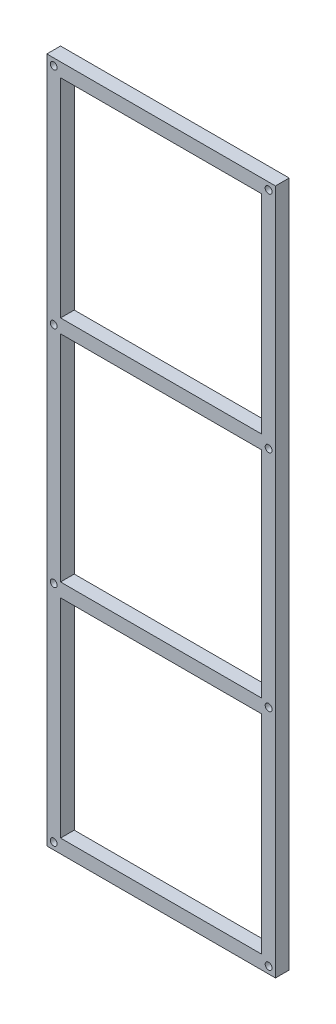
ISO-10303-21;
HEADER;
FILE_DESCRIPTION(('STEP AP214'),'2;1');
FILE_NAME('part.step','',(''),(''),'','','');
FILE_SCHEMA(('AUTOMOTIVE_DESIGN { 1 0 10303 214 1 1 1 1 }'));
ENDSEC;
DATA;
#1=APPLICATION_CONTEXT('core data for automotive mechanical design processes');
#2=APPLICATION_PROTOCOL_DEFINITION('international standard','automotive_design',2000,#1);
#3=PRODUCT_CONTEXT('',#1,'mechanical');
#4=PRODUCT('Part','Part','',(#3));
#5=PRODUCT_RELATED_PRODUCT_CATEGORY('part','',(#4));
#6=PRODUCT_DEFINITION_FORMATION('','',#4);
#7=PRODUCT_DEFINITION_CONTEXT('part definition',#1,'design');
#8=PRODUCT_DEFINITION('design','',#6,#7);
#9=PRODUCT_DEFINITION_SHAPE('','',#8);
#10=(LENGTH_UNIT() NAMED_UNIT(*) SI_UNIT(.MILLI.,.METRE.));
#11=(NAMED_UNIT(*) PLANE_ANGLE_UNIT() SI_UNIT($,.RADIAN.));
#12=(NAMED_UNIT(*) SI_UNIT($,.STERADIAN.) SOLID_ANGLE_UNIT());
#13=UNCERTAINTY_MEASURE_WITH_UNIT(LENGTH_MEASURE(1.E-05),#10,'distance_accuracy_value','');
#14=(GEOMETRIC_REPRESENTATION_CONTEXT(3) GLOBAL_UNCERTAINTY_ASSIGNED_CONTEXT((#13)) GLOBAL_UNIT_ASSIGNED_CONTEXT((#10,
#11,#12)) REPRESENTATION_CONTEXT('',''));
#15=CARTESIAN_POINT('',(0.,0.,0.));
#16=DIRECTION('',(0.,0.,1.));
#17=DIRECTION('',(1.,0.,0.));
#18=AXIS2_PLACEMENT_3D('',#15,#16,#17);
#19=CARTESIAN_POINT('',(0.,0.,6.));
#20=DIRECTION('',(0.,0.,-1.));
#21=DIRECTION('',(-1.,0.,0.));
#22=AXIS2_PLACEMENT_3D('',#19,#20,#21);
#23=PLANE('',#22);
#24=CARTESIAN_POINT('',(-46.999999999998,-49.,6.));
#25=DIRECTION('',(0.,0.,1.));
#26=DIRECTION('',(1.,0.,0.));
#27=AXIS2_PLACEMENT_3D('',#24,#25,#26);
#28=CIRCLE('',#27,1.5);
#29=CARTESIAN_POINT('',(-45.499999999998,-49.,6.));
#30=VERTEX_POINT('',#29);
#31=EDGE_CURVE('E495',#30,#30,#28,.T.);
#32=ORIENTED_EDGE('',*,*,#31,.F.);
#33=EDGE_LOOP('',(#32));
#34=FACE_BOUND('',#33,.T.);
#35=CARTESIAN_POINT('',(47.000000000001,49.,6.));
#36=DIRECTION('',(0.,0.,1.));
#37=DIRECTION('',(1.,0.,0.));
#38=AXIS2_PLACEMENT_3D('',#35,#36,#37);
#39=CIRCLE('',#38,1.5);
#40=CARTESIAN_POINT('',(48.500000000001,49.,6.));
#41=VERTEX_POINT('',#40);
#42=EDGE_CURVE('E486',#41,#41,#39,.T.);
#43=ORIENTED_EDGE('',*,*,#42,.F.);
#44=EDGE_LOOP('',(#43));
#45=FACE_BOUND('',#44,.T.);
#46=CARTESIAN_POINT('',(-46.999999999999,49.,6.));
#47=DIRECTION('',(0.,0.,1.));
#48=DIRECTION('',(1.,0.,0.));
#49=AXIS2_PLACEMENT_3D('',#46,#47,#48);
#50=CIRCLE('',#49,1.5);
#51=CARTESIAN_POINT('',(-45.499999999999,49.,6.));
#52=VERTEX_POINT('',#51);
#53=EDGE_CURVE('E511',#52,#52,#50,.T.);
#54=ORIENTED_EDGE('',*,*,#53,.F.);
#55=EDGE_LOOP('',(#54));
#56=FACE_BOUND('',#55,.T.);
#57=CARTESIAN_POINT('',(47.,147.,6.));
#58=DIRECTION('',(0.,0.,1.));
#59=DIRECTION('',(1.,0.,0.));
#60=AXIS2_PLACEMENT_3D('',#57,#58,#59);
#61=CIRCLE('',#60,1.5);
#62=CARTESIAN_POINT('',(48.5,147.,6.));
#63=VERTEX_POINT('',#62);
#64=EDGE_CURVE('E502',#63,#63,#61,.T.);
#65=ORIENTED_EDGE('',*,*,#64,.F.);
#66=EDGE_LOOP('',(#65));
#67=FACE_BOUND('',#66,.T.);
#68=CARTESIAN_POINT('',(47.0000000000031,-147.,6.));
#69=DIRECTION('',(0.,0.,1.));
#70=DIRECTION('',(1.,0.,0.));
#71=AXIS2_PLACEMENT_3D('',#68,#69,#70);
#72=CIRCLE('',#71,1.5);
#73=CARTESIAN_POINT('',(48.5000000000031,-147.,6.));
#74=VERTEX_POINT('',#73);
#75=EDGE_CURVE('E462',#74,#74,#72,.T.);
#76=ORIENTED_EDGE('',*,*,#75,.F.);
#77=EDGE_LOOP('',(#76));
#78=FACE_BOUND('',#77,.T.);
#79=CARTESIAN_POINT('',(-46.9999999999969,-147.,6.));
#80=DIRECTION('',(0.,0.,1.));
#81=DIRECTION('',(1.,0.,0.));
#82=AXIS2_PLACEMENT_3D('',#79,#80,#81);
#83=CIRCLE('',#82,1.5);
#84=CARTESIAN_POINT('',(-45.4999999999969,-147.,6.));
#85=VERTEX_POINT('',#84);
#86=EDGE_CURVE('E470',#85,#85,#83,.T.);
#87=ORIENTED_EDGE('',*,*,#86,.F.);
#88=EDGE_LOOP('',(#87));
#89=FACE_BOUND('',#88,.T.);
#90=CARTESIAN_POINT('',(47.000000000002,-49.,6.));
#91=DIRECTION('',(0.,0.,1.));
#92=DIRECTION('',(1.,0.,0.));
#93=AXIS2_PLACEMENT_3D('',#90,#91,#92);
#94=CIRCLE('',#93,1.5);
#95=CARTESIAN_POINT('',(48.500000000002,-49.,6.));
#96=VERTEX_POINT('',#95);
#97=EDGE_CURVE('E474',#96,#96,#94,.T.);
#98=ORIENTED_EDGE('',*,*,#97,.F.);
#99=EDGE_LOOP('',(#98));
#100=FACE_BOUND('',#99,.T.);
#101=CARTESIAN_POINT('',(-47.,147.,6.));
#102=DIRECTION('',(0.,0.,1.));
#103=DIRECTION('',(1.,0.,0.));
#104=AXIS2_PLACEMENT_3D('',#101,#102,#103);
#105=CIRCLE('',#104,1.5);
#106=CARTESIAN_POINT('',(-45.5,147.,6.));
#107=VERTEX_POINT('',#106);
#108=EDGE_CURVE('E506',#107,#107,#105,.T.);
#109=ORIENTED_EDGE('',*,*,#108,.F.);
#110=EDGE_LOOP('',(#109));
#111=FACE_BOUND('',#110,.T.);
#112=DIRECTION('',(0.,-1.,0.));
#113=VECTOR('',#112,1.);
#114=CARTESIAN_POINT('',(-44.,-144.,6.));
#115=LINE('',#114,#113);
#116=CARTESIAN_POINT('',(-44.,-53.,6.));
#117=VERTEX_POINT('',#116);
#118=CARTESIAN_POINT('',(-44.,-144.,6.));
#119=VERTEX_POINT('',#118);
#120=EDGE_CURVE('E203',#117,#119,#115,.T.);
#121=ORIENTED_EDGE('',*,*,#120,.F.);
#122=DIRECTION('',(-1.,0.,0.));
#123=VECTOR('',#122,1.);
#124=CARTESIAN_POINT('',(-44.,-53.,6.));
#125=LINE('',#124,#123);
#126=CARTESIAN_POINT('',(44.,-53.,6.));
#127=VERTEX_POINT('',#126);
#128=EDGE_CURVE('E214',#127,#117,#125,.T.);
#129=ORIENTED_EDGE('',*,*,#128,.F.);
#130=DIRECTION('',(0.,1.,0.));
#131=VECTOR('',#130,1.);
#132=CARTESIAN_POINT('',(44.,-53.,6.));
#133=LINE('',#132,#131);
#134=CARTESIAN_POINT('',(44.,-144.,6.));
#135=VERTEX_POINT('',#134);
#136=EDGE_CURVE('E210',#135,#127,#133,.T.);
#137=ORIENTED_EDGE('',*,*,#136,.F.);
#138=DIRECTION('',(1.,0.,0.));
#139=VECTOR('',#138,1.);
#140=CARTESIAN_POINT('',(-44.,-144.,6.));
#141=LINE('',#140,#139);
#142=EDGE_CURVE('E206',#119,#135,#141,.T.);
#143=ORIENTED_EDGE('',*,*,#142,.F.);
#144=EDGE_LOOP('',(#121,#129,#137,#143));
#145=FACE_BOUND('',#144,.T.);
#146=DIRECTION('',(0.,1.,0.));
#147=VECTOR('',#146,1.);
#148=CARTESIAN_POINT('',(50.,-150.,6.));
#149=LINE('',#148,#147);
#150=CARTESIAN_POINT('',(50.,-150.,6.));
#151=VERTEX_POINT('',#150);
#152=CARTESIAN_POINT('',(50.,150.,6.));
#153=VERTEX_POINT('',#152);
#154=EDGE_CURVE('E289',#151,#153,#149,.T.);
#155=ORIENTED_EDGE('',*,*,#154,.T.);
#156=DIRECTION('',(-1.,0.,0.));
#157=VECTOR('',#156,1.);
#158=CARTESIAN_POINT('',(-50.,150.,6.));
#159=LINE('',#158,#157);
#160=CARTESIAN_POINT('',(-50.,150.,6.));
#161=VERTEX_POINT('',#160);
#162=EDGE_CURVE('E293',#153,#161,#159,.T.);
#163=ORIENTED_EDGE('',*,*,#162,.T.);
#164=DIRECTION('',(0.,-1.,0.));
#165=VECTOR('',#164,1.);
#166=CARTESIAN_POINT('',(-50.,-150.,6.));
#167=LINE('',#166,#165);
#168=CARTESIAN_POINT('',(-50.,-150.,6.));
#169=VERTEX_POINT('',#168);
#170=EDGE_CURVE('E297',#161,#169,#167,.T.);
#171=ORIENTED_EDGE('',*,*,#170,.T.);
#172=DIRECTION('',(1.,0.,0.));
#173=VECTOR('',#172,1.);
#174=CARTESIAN_POINT('',(-50.,-150.,6.));
#175=LINE('',#174,#173);
#176=EDGE_CURVE('E300',#169,#151,#175,.T.);
#177=ORIENTED_EDGE('',*,*,#176,.T.);
#178=EDGE_LOOP('',(#155,#163,#171,#177));
#179=FACE_BOUND('',#178,.T.);
#180=DIRECTION('',(-1.,0.,0.));
#181=VECTOR('',#180,1.);
#182=CARTESIAN_POINT('',(-44.,144.,6.));
#183=LINE('',#182,#181);
#184=CARTESIAN_POINT('',(44.,144.,6.));
#185=VERTEX_POINT('',#184);
#186=CARTESIAN_POINT('',(-44.,144.,6.));
#187=VERTEX_POINT('',#186);
#188=EDGE_CURVE('E246',#185,#187,#183,.T.);
#189=ORIENTED_EDGE('',*,*,#188,.F.);
#190=DIRECTION('',(0.,1.,0.));
#191=VECTOR('',#190,1.);
#192=CARTESIAN_POINT('',(44.,144.,6.));
#193=LINE('',#192,#191);
#194=CARTESIAN_POINT('',(44.,53.,6.));
#195=VERTEX_POINT('',#194);
#196=EDGE_CURVE('E257',#195,#185,#193,.T.);
#197=ORIENTED_EDGE('',*,*,#196,.F.);
#198=DIRECTION('',(1.,0.,0.));
#199=VECTOR('',#198,1.);
#200=CARTESIAN_POINT('',(-44.,53.,6.));
#201=LINE('',#200,#199);
#202=CARTESIAN_POINT('',(-44.,53.,6.));
#203=VERTEX_POINT('',#202);
#204=EDGE_CURVE('E253',#203,#195,#201,.T.);
#205=ORIENTED_EDGE('',*,*,#204,.F.);
#206=DIRECTION('',(0.,-1.,0.));
#207=VECTOR('',#206,1.);
#208=CARTESIAN_POINT('',(-44.,53.,6.));
#209=LINE('',#208,#207);
#210=EDGE_CURVE('E249',#187,#203,#209,.T.);
#211=ORIENTED_EDGE('',*,*,#210,.F.);
#212=EDGE_LOOP('',(#189,#197,#205,#211));
#213=FACE_BOUND('',#212,.T.);
#214=DIRECTION('',(0.,1.,0.));
#215=VECTOR('',#214,1.);
#216=CARTESIAN_POINT('',(44.,47.,6.));
#217=LINE('',#216,#215);
#218=CARTESIAN_POINT('',(44.,-47.,6.));
#219=VERTEX_POINT('',#218);
#220=CARTESIAN_POINT('',(44.,47.,6.));
#221=VERTEX_POINT('',#220);
#222=EDGE_CURVE('E153',#219,#221,#217,.T.);
#223=ORIENTED_EDGE('',*,*,#222,.F.);
#224=DIRECTION('',(1.,0.,0.));
#225=VECTOR('',#224,1.);
#226=CARTESIAN_POINT('',(-44.,-47.,6.));
#227=LINE('',#226,#225);
#228=CARTESIAN_POINT('',(-44.,-47.,6.));
#229=VERTEX_POINT('',#228);
#230=EDGE_CURVE('E179',#229,#219,#227,.T.);
#231=ORIENTED_EDGE('',*,*,#230,.F.);
#232=DIRECTION('',(0.,-1.,0.));
#233=VECTOR('',#232,1.);
#234=CARTESIAN_POINT('',(-44.,-47.,6.));
#235=LINE('',#234,#233);
#236=CARTESIAN_POINT('',(-44.,47.,6.));
#237=VERTEX_POINT('',#236);
#238=EDGE_CURVE('E175',#237,#229,#235,.T.);
#239=ORIENTED_EDGE('',*,*,#238,.F.);
#240=DIRECTION('',(-1.,0.,0.));
#241=VECTOR('',#240,1.);
#242=CARTESIAN_POINT('',(-44.,47.,6.));
#243=LINE('',#242,#241);
#244=EDGE_CURVE('E162',#221,#237,#243,.T.);
#245=ORIENTED_EDGE('',*,*,#244,.F.);
#246=EDGE_LOOP('',(#223,#231,#239,#245));
#247=FACE_BOUND('',#246,.T.);
#248=ADVANCED_FACE('F39',(#34,#45,#56,#67,#78,#89,#100,#111,#145,#179,#213,#247),#23,.F.);
#249=CARTESIAN_POINT('',(0.,0.,0.));
#250=DIRECTION('',(0.,0.,-1.));
#251=DIRECTION('',(-1.,0.,0.));
#252=AXIS2_PLACEMENT_3D('',#249,#250,#251);
#253=PLANE('',#252);
#254=CARTESIAN_POINT('',(-46.999999999998,-49.,0.));
#255=DIRECTION('',(0.,0.,1.));
#256=DIRECTION('',(1.,0.,0.));
#257=AXIS2_PLACEMENT_3D('',#254,#255,#256);
#258=CIRCLE('',#257,1.5);
#259=CARTESIAN_POINT('',(-45.499999999998,-49.,0.));
#260=VERTEX_POINT('',#259);
#261=EDGE_CURVE('E478',#260,#260,#258,.T.);
#262=ORIENTED_EDGE('',*,*,#261,.T.);
#263=EDGE_LOOP('',(#262));
#264=FACE_BOUND('',#263,.T.);
#265=CARTESIAN_POINT('',(47.000000000001,49.,0.));
#266=DIRECTION('',(0.,0.,1.));
#267=DIRECTION('',(1.,0.,0.));
#268=AXIS2_PLACEMENT_3D('',#265,#266,#267);
#269=CIRCLE('',#268,1.5);
#270=CARTESIAN_POINT('',(48.500000000001,49.,0.));
#271=VERTEX_POINT('',#270);
#272=EDGE_CURVE('E491',#271,#271,#269,.T.);
#273=ORIENTED_EDGE('',*,*,#272,.T.);
#274=EDGE_LOOP('',(#273));
#275=FACE_BOUND('',#274,.T.);
#276=CARTESIAN_POINT('',(-46.999999999999,49.,0.));
#277=DIRECTION('',(0.,0.,1.));
#278=DIRECTION('',(1.,0.,0.));
#279=AXIS2_PLACEMENT_3D('',#276,#277,#278);
#280=CIRCLE('',#279,1.5);
#281=CARTESIAN_POINT('',(-45.499999999999,49.,0.));
#282=VERTEX_POINT('',#281);
#283=EDGE_CURVE('E490',#282,#282,#280,.T.);
#284=ORIENTED_EDGE('',*,*,#283,.T.);
#285=EDGE_LOOP('',(#284));
#286=FACE_BOUND('',#285,.T.);
#287=CARTESIAN_POINT('',(47.,147.,0.));
#288=DIRECTION('',(0.,0.,1.));
#289=DIRECTION('',(1.,0.,0.));
#290=AXIS2_PLACEMENT_3D('',#287,#288,#289);
#291=CIRCLE('',#290,1.5);
#292=CARTESIAN_POINT('',(48.5,147.,0.));
#293=VERTEX_POINT('',#292);
#294=EDGE_CURVE('E507',#293,#293,#291,.T.);
#295=ORIENTED_EDGE('',*,*,#294,.T.);
#296=EDGE_LOOP('',(#295));
#297=FACE_BOUND('',#296,.T.);
#298=CARTESIAN_POINT('',(47.0000000000031,-147.,0.));
#299=DIRECTION('',(0.,0.,1.));
#300=DIRECTION('',(1.,0.,0.));
#301=AXIS2_PLACEMENT_3D('',#298,#299,#300);
#302=CIRCLE('',#301,1.5);
#303=CARTESIAN_POINT('',(48.5000000000031,-147.,0.));
#304=VERTEX_POINT('',#303);
#305=EDGE_CURVE('E459',#304,#304,#302,.T.);
#306=ORIENTED_EDGE('',*,*,#305,.T.);
#307=EDGE_LOOP('',(#306));
#308=FACE_BOUND('',#307,.T.);
#309=CARTESIAN_POINT('',(-46.9999999999969,-147.,0.));
#310=DIRECTION('',(0.,0.,1.));
#311=DIRECTION('',(1.,0.,0.));
#312=AXIS2_PLACEMENT_3D('',#309,#310,#311);
#313=CIRCLE('',#312,1.5);
#314=CARTESIAN_POINT('',(-45.4999999999969,-147.,0.));
#315=VERTEX_POINT('',#314);
#316=EDGE_CURVE('E465',#315,#315,#313,.T.);
#317=ORIENTED_EDGE('',*,*,#316,.T.);
#318=EDGE_LOOP('',(#317));
#319=FACE_BOUND('',#318,.T.);
#320=CARTESIAN_POINT('',(47.000000000002,-49.,0.));
#321=DIRECTION('',(0.,0.,1.));
#322=DIRECTION('',(1.,0.,0.));
#323=AXIS2_PLACEMENT_3D('',#320,#321,#322);
#324=CIRCLE('',#323,1.5);
#325=CARTESIAN_POINT('',(48.500000000002,-49.,0.));
#326=VERTEX_POINT('',#325);
#327=EDGE_CURVE('E479',#326,#326,#324,.T.);
#328=ORIENTED_EDGE('',*,*,#327,.T.);
#329=EDGE_LOOP('',(#328));
#330=FACE_BOUND('',#329,.T.);
#331=CARTESIAN_POINT('',(-47.,147.,0.));
#332=DIRECTION('',(0.,0.,1.));
#333=DIRECTION('',(1.,0.,0.));
#334=AXIS2_PLACEMENT_3D('',#331,#332,#333);
#335=CIRCLE('',#334,1.5);
#336=CARTESIAN_POINT('',(-45.5,147.,0.));
#337=VERTEX_POINT('',#336);
#338=EDGE_CURVE('E187',#337,#337,#335,.T.);
#339=ORIENTED_EDGE('',*,*,#338,.T.);
#340=EDGE_LOOP('',(#339));
#341=FACE_BOUND('',#340,.T.);
#342=DIRECTION('',(0.,1.,0.));
#343=VECTOR('',#342,1.);
#344=CARTESIAN_POINT('',(50.,-150.,0.));
#345=LINE('',#344,#343);
#346=CARTESIAN_POINT('',(50.,-150.,0.));
#347=VERTEX_POINT('',#346);
#348=CARTESIAN_POINT('',(50.,150.,0.));
#349=VERTEX_POINT('',#348);
#350=EDGE_CURVE('E288',#347,#349,#345,.T.);
#351=ORIENTED_EDGE('',*,*,#350,.F.);
#352=DIRECTION('',(1.,0.,0.));
#353=VECTOR('',#352,1.);
#354=CARTESIAN_POINT('',(-50.,-150.,0.));
#355=LINE('',#354,#353);
#356=CARTESIAN_POINT('',(-50.,-150.,0.));
#357=VERTEX_POINT('',#356);
#358=EDGE_CURVE('E294',#357,#347,#355,.T.);
#359=ORIENTED_EDGE('',*,*,#358,.F.);
#360=DIRECTION('',(0.,-1.,0.));
#361=VECTOR('',#360,1.);
#362=CARTESIAN_POINT('',(-50.,-150.,0.));
#363=LINE('',#362,#361);
#364=CARTESIAN_POINT('',(-50.,150.,0.));
#365=VERTEX_POINT('',#364);
#366=EDGE_CURVE('E310',#365,#357,#363,.T.);
#367=ORIENTED_EDGE('',*,*,#366,.F.);
#368=DIRECTION('',(-1.,0.,0.));
#369=VECTOR('',#368,1.);
#370=CARTESIAN_POINT('',(-50.,150.,0.));
#371=LINE('',#370,#369);
#372=EDGE_CURVE('E307',#349,#365,#371,.T.);
#373=ORIENTED_EDGE('',*,*,#372,.F.);
#374=EDGE_LOOP('',(#351,#359,#367,#373));
#375=FACE_BOUND('',#374,.T.);
#376=DIRECTION('',(0.,1.,0.));
#377=VECTOR('',#376,1.);
#378=CARTESIAN_POINT('',(44.,144.,0.));
#379=LINE('',#378,#377);
#380=CARTESIAN_POINT('',(44.,53.,0.));
#381=VERTEX_POINT('',#380);
#382=CARTESIAN_POINT('',(44.,144.,0.));
#383=VERTEX_POINT('',#382);
#384=EDGE_CURVE('E250',#381,#383,#379,.T.);
#385=ORIENTED_EDGE('',*,*,#384,.T.);
#386=DIRECTION('',(-1.,0.,0.));
#387=VECTOR('',#386,1.);
#388=CARTESIAN_POINT('',(-44.,144.,0.));
#389=LINE('',#388,#387);
#390=CARTESIAN_POINT('',(-44.,144.,0.));
#391=VERTEX_POINT('',#390);
#392=EDGE_CURVE('E245',#383,#391,#389,.T.);
#393=ORIENTED_EDGE('',*,*,#392,.T.);
#394=DIRECTION('',(0.,-1.,0.));
#395=VECTOR('',#394,1.);
#396=CARTESIAN_POINT('',(-44.,53.,0.));
#397=LINE('',#396,#395);
#398=CARTESIAN_POINT('',(-44.,53.,0.));
#399=VERTEX_POINT('',#398);
#400=EDGE_CURVE('E264',#391,#399,#397,.T.);
#401=ORIENTED_EDGE('',*,*,#400,.T.);
#402=DIRECTION('',(1.,0.,0.));
#403=VECTOR('',#402,1.);
#404=CARTESIAN_POINT('',(-44.,53.,0.));
#405=LINE('',#404,#403);
#406=EDGE_CURVE('E268',#399,#381,#405,.T.);
#407=ORIENTED_EDGE('',*,*,#406,.T.);
#408=EDGE_LOOP('',(#385,#393,#401,#407));
#409=FACE_BOUND('',#408,.T.);
#410=DIRECTION('',(-1.,0.,0.));
#411=VECTOR('',#410,1.);
#412=CARTESIAN_POINT('',(-44.,-53.,0.));
#413=LINE('',#412,#411);
#414=CARTESIAN_POINT('',(44.,-53.,0.));
#415=VERTEX_POINT('',#414);
#416=CARTESIAN_POINT('',(-44.,-53.,0.));
#417=VERTEX_POINT('',#416);
#418=EDGE_CURVE('E207',#415,#417,#413,.T.);
#419=ORIENTED_EDGE('',*,*,#418,.T.);
#420=DIRECTION('',(0.,-1.,0.));
#421=VECTOR('',#420,1.);
#422=CARTESIAN_POINT('',(-44.,-144.,0.));
#423=LINE('',#422,#421);
#424=CARTESIAN_POINT('',(-44.,-144.,0.));
#425=VERTEX_POINT('',#424);
#426=EDGE_CURVE('E171',#417,#425,#423,.T.);
#427=ORIENTED_EDGE('',*,*,#426,.T.);
#428=DIRECTION('',(1.,0.,0.));
#429=VECTOR('',#428,1.);
#430=CARTESIAN_POINT('',(-44.,-144.,0.));
#431=LINE('',#430,#429);
#432=CARTESIAN_POINT('',(44.,-144.,0.));
#433=VERTEX_POINT('',#432);
#434=EDGE_CURVE('E221',#425,#433,#431,.T.);
#435=ORIENTED_EDGE('',*,*,#434,.T.);
#436=DIRECTION('',(0.,1.,0.));
#437=VECTOR('',#436,1.);
#438=CARTESIAN_POINT('',(44.,-53.,0.));
#439=LINE('',#438,#437);
#440=EDGE_CURVE('E225',#433,#415,#439,.T.);
#441=ORIENTED_EDGE('',*,*,#440,.T.);
#442=EDGE_LOOP('',(#419,#427,#435,#441));
#443=FACE_BOUND('',#442,.T.);
#444=DIRECTION('',(1.,0.,0.));
#445=VECTOR('',#444,1.);
#446=CARTESIAN_POINT('',(-44.,-47.,0.));
#447=LINE('',#446,#445);
#448=CARTESIAN_POINT('',(-44.,-47.,0.));
#449=VERTEX_POINT('',#448);
#450=CARTESIAN_POINT('',(44.,-47.,0.));
#451=VERTEX_POINT('',#450);
#452=EDGE_CURVE('E163',#449,#451,#447,.T.);
#453=ORIENTED_EDGE('',*,*,#452,.T.);
#454=DIRECTION('',(0.,1.,0.));
#455=VECTOR('',#454,1.);
#456=CARTESIAN_POINT('',(44.,47.,0.));
#457=LINE('',#456,#455);
#458=CARTESIAN_POINT('',(44.,47.,0.));
#459=VERTEX_POINT('',#458);
#460=EDGE_CURVE('E63',#451,#459,#457,.T.);
#461=ORIENTED_EDGE('',*,*,#460,.T.);
#462=DIRECTION('',(-1.,0.,0.));
#463=VECTOR('',#462,1.);
#464=CARTESIAN_POINT('',(-44.,47.,0.));
#465=LINE('',#464,#463);
#466=CARTESIAN_POINT('',(-44.,47.,0.));
#467=VERTEX_POINT('',#466);
#468=EDGE_CURVE('E169',#459,#467,#465,.T.);
#469=ORIENTED_EDGE('',*,*,#468,.T.);
#470=DIRECTION('',(0.,-1.,0.));
#471=VECTOR('',#470,1.);
#472=CARTESIAN_POINT('',(-44.,-47.,0.));
#473=LINE('',#472,#471);
#474=EDGE_CURVE('E190',#467,#449,#473,.T.);
#475=ORIENTED_EDGE('',*,*,#474,.T.);
#476=EDGE_LOOP('',(#453,#461,#469,#475));
#477=FACE_BOUND('',#476,.T.);
#478=ADVANCED_FACE('F333',(#264,#275,#286,#297,#308,#319,#330,#341,#375,#409,#443,#477),#253,.T.);
#479=CARTESIAN_POINT('',(50.,-150.,6.));
#480=DIRECTION('',(-1.,0.,0.));
#481=DIRECTION('',(0.,0.,1.));
#482=AXIS2_PLACEMENT_3D('',#479,#480,#481);
#483=PLANE('',#482);
#484=ORIENTED_EDGE('',*,*,#350,.T.);
#485=DIRECTION('',(0.,0.,-1.));
#486=VECTOR('',#485,1.);
#487=CARTESIAN_POINT('',(50.,150.,6.));
#488=LINE('',#487,#486);
#489=EDGE_CURVE('E11',#153,#349,#488,.T.);
#490=ORIENTED_EDGE('',*,*,#489,.F.);
#491=ORIENTED_EDGE('',*,*,#154,.F.);
#492=DIRECTION('',(0.,0.,-1.));
#493=VECTOR('',#492,1.);
#494=CARTESIAN_POINT('',(50.,-150.,6.));
#495=LINE('',#494,#493);
#496=EDGE_CURVE('E303',#151,#347,#495,.T.);
#497=ORIENTED_EDGE('',*,*,#496,.T.);
#498=EDGE_LOOP('',(#484,#490,#491,#497));
#499=FACE_BOUND('',#498,.T.);
#500=ADVANCED_FACE('F41',(#499),#483,.F.);
#501=CARTESIAN_POINT('',(-50.,150.,6.));
#502=DIRECTION('',(0.,-1.,0.));
#503=DIRECTION('',(0.,0.,-1.));
#504=AXIS2_PLACEMENT_3D('',#501,#502,#503);
#505=PLANE('',#504);
#506=ORIENTED_EDGE('',*,*,#372,.T.);
#507=DIRECTION('',(0.,0.,-1.));
#508=VECTOR('',#507,1.);
#509=CARTESIAN_POINT('',(-50.,150.,6.));
#510=LINE('',#509,#508);
#511=EDGE_CURVE('E48',#161,#365,#510,.T.);
#512=ORIENTED_EDGE('',*,*,#511,.F.);
#513=ORIENTED_EDGE('',*,*,#162,.F.);
#514=ORIENTED_EDGE('',*,*,#489,.T.);
#515=EDGE_LOOP('',(#506,#512,#513,#514));
#516=FACE_BOUND('',#515,.T.);
#517=ADVANCED_FACE('F344',(#516),#505,.F.);
#518=CARTESIAN_POINT('',(-50.,-150.,6.));
#519=DIRECTION('',(1.,0.,0.));
#520=DIRECTION('',(0.,0.,-1.));
#521=AXIS2_PLACEMENT_3D('',#518,#519,#520);
#522=PLANE('',#521);
#523=ORIENTED_EDGE('',*,*,#366,.T.);
#524=DIRECTION('',(0.,0.,-1.));
#525=VECTOR('',#524,1.);
#526=CARTESIAN_POINT('',(-50.,-150.,6.));
#527=LINE('',#526,#525);
#528=EDGE_CURVE('E318',#169,#357,#527,.T.);
#529=ORIENTED_EDGE('',*,*,#528,.F.);
#530=ORIENTED_EDGE('',*,*,#170,.F.);
#531=ORIENTED_EDGE('',*,*,#511,.T.);
#532=EDGE_LOOP('',(#523,#529,#530,#531));
#533=FACE_BOUND('',#532,.T.);
#534=ADVANCED_FACE('F327',(#533),#522,.F.);
#535=CARTESIAN_POINT('',(-50.,-150.,6.));
#536=DIRECTION('',(0.,1.,0.));
#537=DIRECTION('',(0.,0.,1.));
#538=AXIS2_PLACEMENT_3D('',#535,#536,#537);
#539=PLANE('',#538);
#540=ORIENTED_EDGE('',*,*,#358,.T.);
#541=ORIENTED_EDGE('',*,*,#496,.F.);
#542=ORIENTED_EDGE('',*,*,#176,.F.);
#543=ORIENTED_EDGE('',*,*,#528,.T.);
#544=EDGE_LOOP('',(#540,#541,#542,#543));
#545=FACE_BOUND('',#544,.T.);
#546=ADVANCED_FACE('F337',(#545),#539,.F.);
#547=CARTESIAN_POINT('',(-44.,144.,6.));
#548=DIRECTION('',(0.,-1.,0.));
#549=DIRECTION('',(0.,0.,-1.));
#550=AXIS2_PLACEMENT_3D('',#547,#548,#549);
#551=PLANE('',#550);
#552=ORIENTED_EDGE('',*,*,#392,.F.);
#553=DIRECTION('',(0.,0.,-1.));
#554=VECTOR('',#553,1.);
#555=CARTESIAN_POINT('',(44.,144.,6.));
#556=LINE('',#555,#554);
#557=EDGE_CURVE('E260',#185,#383,#556,.T.);
#558=ORIENTED_EDGE('',*,*,#557,.F.);
#559=ORIENTED_EDGE('',*,*,#188,.T.);
#560=DIRECTION('',(0.,0.,-1.));
#561=VECTOR('',#560,1.);
#562=CARTESIAN_POINT('',(-44.,144.,6.));
#563=LINE('',#562,#561);
#564=EDGE_CURVE('E284',#187,#391,#563,.T.);
#565=ORIENTED_EDGE('',*,*,#564,.T.);
#566=EDGE_LOOP('',(#552,#558,#559,#565));
#567=FACE_BOUND('',#566,.T.);
#568=ADVANCED_FACE('F362',(#567),#551,.T.);
#569=CARTESIAN_POINT('',(-44.,53.,6.));
#570=DIRECTION('',(1.,0.,0.));
#571=DIRECTION('',(0.,0.,-1.));
#572=AXIS2_PLACEMENT_3D('',#569,#570,#571);
#573=PLANE('',#572);
#574=ORIENTED_EDGE('',*,*,#400,.F.);
#575=ORIENTED_EDGE('',*,*,#564,.F.);
#576=ORIENTED_EDGE('',*,*,#210,.T.);
#577=DIRECTION('',(0.,0.,-1.));
#578=VECTOR('',#577,1.);
#579=CARTESIAN_POINT('',(-44.,53.,6.));
#580=LINE('',#579,#578);
#581=EDGE_CURVE('E281',#203,#399,#580,.T.);
#582=ORIENTED_EDGE('',*,*,#581,.T.);
#583=EDGE_LOOP('',(#574,#575,#576,#582));
#584=FACE_BOUND('',#583,.T.);
#585=ADVANCED_FACE('F369',(#584),#573,.T.);
#586=CARTESIAN_POINT('',(-44.,53.,6.));
#587=DIRECTION('',(0.,1.,0.));
#588=DIRECTION('',(0.,0.,1.));
#589=AXIS2_PLACEMENT_3D('',#586,#587,#588);
#590=PLANE('',#589);
#591=ORIENTED_EDGE('',*,*,#406,.F.);
#592=ORIENTED_EDGE('',*,*,#581,.F.);
#593=ORIENTED_EDGE('',*,*,#204,.T.);
#594=DIRECTION('',(0.,0.,-1.));
#595=VECTOR('',#594,1.);
#596=CARTESIAN_POINT('',(44.,53.,6.));
#597=LINE('',#596,#595);
#598=EDGE_CURVE('E278',#195,#381,#597,.T.);
#599=ORIENTED_EDGE('',*,*,#598,.T.);
#600=EDGE_LOOP('',(#591,#592,#593,#599));
#601=FACE_BOUND('',#600,.T.);
#602=ADVANCED_FACE('F374',(#601),#590,.T.);
#603=CARTESIAN_POINT('',(44.,144.,6.));
#604=DIRECTION('',(-1.,0.,0.));
#605=DIRECTION('',(0.,0.,1.));
#606=AXIS2_PLACEMENT_3D('',#603,#604,#605);
#607=PLANE('',#606);
#608=ORIENTED_EDGE('',*,*,#384,.F.);
#609=ORIENTED_EDGE('',*,*,#598,.F.);
#610=ORIENTED_EDGE('',*,*,#196,.T.);
#611=ORIENTED_EDGE('',*,*,#557,.T.);
#612=EDGE_LOOP('',(#608,#609,#610,#611));
#613=FACE_BOUND('',#612,.T.);
#614=ADVANCED_FACE('F381',(#613),#607,.T.);
#615=CARTESIAN_POINT('',(-44.,-144.,6.));
#616=DIRECTION('',(1.,0.,0.));
#617=DIRECTION('',(0.,1.,0.));
#618=AXIS2_PLACEMENT_3D('',#615,#616,#617);
#619=PLANE('',#618);
#620=ORIENTED_EDGE('',*,*,#426,.F.);
#621=DIRECTION('',(0.,0.,-1.));
#622=VECTOR('',#621,1.);
#623=CARTESIAN_POINT('',(-44.,-53.,6.));
#624=LINE('',#623,#622);
#625=EDGE_CURVE('E217',#117,#417,#624,.T.);
#626=ORIENTED_EDGE('',*,*,#625,.F.);
#627=ORIENTED_EDGE('',*,*,#120,.T.);
#628=DIRECTION('',(0.,0.,-1.));
#629=VECTOR('',#628,1.);
#630=CARTESIAN_POINT('',(-44.,-144.,6.));
#631=LINE('',#630,#629);
#632=EDGE_CURVE('E241',#119,#425,#631,.T.);
#633=ORIENTED_EDGE('',*,*,#632,.T.);
#634=EDGE_LOOP('',(#620,#626,#627,#633));
#635=FACE_BOUND('',#634,.T.);
#636=ADVANCED_FACE('F394',(#635),#619,.T.);
#637=CARTESIAN_POINT('',(-44.,-144.,6.));
#638=DIRECTION('',(0.,1.,0.));
#639=DIRECTION('',(0.,0.,1.));
#640=AXIS2_PLACEMENT_3D('',#637,#638,#639);
#641=PLANE('',#640);
#642=ORIENTED_EDGE('',*,*,#434,.F.);
#643=ORIENTED_EDGE('',*,*,#632,.F.);
#644=ORIENTED_EDGE('',*,*,#142,.T.);
#645=DIRECTION('',(0.,0.,-1.));
#646=VECTOR('',#645,1.);
#647=CARTESIAN_POINT('',(44.,-144.,6.));
#648=LINE('',#647,#646);
#649=EDGE_CURVE('E238',#135,#433,#648,.T.);
#650=ORIENTED_EDGE('',*,*,#649,.T.);
#651=EDGE_LOOP('',(#642,#643,#644,#650));
#652=FACE_BOUND('',#651,.T.);
#653=ADVANCED_FACE('F399',(#652),#641,.T.);
#654=CARTESIAN_POINT('',(44.,-53.,6.));
#655=DIRECTION('',(-1.,0.,0.));
#656=DIRECTION('',(0.,-1.,0.));
#657=AXIS2_PLACEMENT_3D('',#654,#655,#656);
#658=PLANE('',#657);
#659=ORIENTED_EDGE('',*,*,#440,.F.);
#660=ORIENTED_EDGE('',*,*,#649,.F.);
#661=ORIENTED_EDGE('',*,*,#136,.T.);
#662=DIRECTION('',(0.,0.,-1.));
#663=VECTOR('',#662,1.);
#664=CARTESIAN_POINT('',(44.,-53.,6.));
#665=LINE('',#664,#663);
#666=EDGE_CURVE('E235',#127,#415,#665,.T.);
#667=ORIENTED_EDGE('',*,*,#666,.T.);
#668=EDGE_LOOP('',(#659,#660,#661,#667));
#669=FACE_BOUND('',#668,.T.);
#670=ADVANCED_FACE('F403',(#669),#658,.T.);
#671=CARTESIAN_POINT('',(-44.,-53.,6.));
#672=DIRECTION('',(0.,-1.,0.));
#673=DIRECTION('',(1.,0.,0.));
#674=AXIS2_PLACEMENT_3D('',#671,#672,#673);
#675=PLANE('',#674);
#676=ORIENTED_EDGE('',*,*,#418,.F.);
#677=ORIENTED_EDGE('',*,*,#666,.F.);
#678=ORIENTED_EDGE('',*,*,#128,.T.);
#679=ORIENTED_EDGE('',*,*,#625,.T.);
#680=EDGE_LOOP('',(#676,#677,#678,#679));
#681=FACE_BOUND('',#680,.T.);
#682=ADVANCED_FACE('F407',(#681),#675,.T.);
#683=CARTESIAN_POINT('',(44.,47.,6.));
#684=DIRECTION('',(-1.,0.,0.));
#685=DIRECTION('',(0.,-1.,0.));
#686=AXIS2_PLACEMENT_3D('',#683,#684,#685);
#687=PLANE('',#686);
#688=ORIENTED_EDGE('',*,*,#460,.F.);
#689=DIRECTION('',(0.,0.,-1.));
#690=VECTOR('',#689,1.);
#691=CARTESIAN_POINT('',(44.,-47.,6.));
#692=LINE('',#691,#690);
#693=EDGE_CURVE('E157',#219,#451,#692,.T.);
#694=ORIENTED_EDGE('',*,*,#693,.F.);
#695=ORIENTED_EDGE('',*,*,#222,.T.);
#696=DIRECTION('',(0.,0.,-1.));
#697=VECTOR('',#696,1.);
#698=CARTESIAN_POINT('',(44.,47.,6.));
#699=LINE('',#698,#697);
#700=EDGE_CURVE('E156',#221,#459,#699,.T.);
#701=ORIENTED_EDGE('',*,*,#700,.T.);
#702=EDGE_LOOP('',(#688,#694,#695,#701));
#703=FACE_BOUND('',#702,.T.);
#704=ADVANCED_FACE('F155',(#703),#687,.T.);
#705=CARTESIAN_POINT('',(-44.,47.,6.));
#706=DIRECTION('',(0.,-1.,0.));
#707=DIRECTION('',(1.,0.,0.));
#708=AXIS2_PLACEMENT_3D('',#705,#706,#707);
#709=PLANE('',#708);
#710=ORIENTED_EDGE('',*,*,#468,.F.);
#711=ORIENTED_EDGE('',*,*,#700,.F.);
#712=ORIENTED_EDGE('',*,*,#244,.T.);
#713=DIRECTION('',(0.,0.,-1.));
#714=VECTOR('',#713,1.);
#715=CARTESIAN_POINT('',(-44.,47.,6.));
#716=LINE('',#715,#714);
#717=EDGE_CURVE('E172',#237,#467,#716,.T.);
#718=ORIENTED_EDGE('',*,*,#717,.T.);
#719=EDGE_LOOP('',(#710,#711,#712,#718));
#720=FACE_BOUND('',#719,.T.);
#721=ADVANCED_FACE('F166',(#720),#709,.T.);
#722=CARTESIAN_POINT('',(-44.,-47.,6.));
#723=DIRECTION('',(1.,0.,0.));
#724=DIRECTION('',(0.,1.,0.));
#725=AXIS2_PLACEMENT_3D('',#722,#723,#724);
#726=PLANE('',#725);
#727=ORIENTED_EDGE('',*,*,#474,.F.);
#728=ORIENTED_EDGE('',*,*,#717,.F.);
#729=ORIENTED_EDGE('',*,*,#238,.T.);
#730=DIRECTION('',(0.,0.,-1.));
#731=VECTOR('',#730,1.);
#732=CARTESIAN_POINT('',(-44.,-47.,6.));
#733=LINE('',#732,#731);
#734=EDGE_CURVE('E55',#229,#449,#733,.T.);
#735=ORIENTED_EDGE('',*,*,#734,.T.);
#736=EDGE_LOOP('',(#727,#728,#729,#735));
#737=FACE_BOUND('',#736,.T.);
#738=ADVANCED_FACE('F416',(#737),#726,.T.);
#739=CARTESIAN_POINT('',(-44.,-47.,6.));
#740=DIRECTION('',(0.,1.,0.));
#741=DIRECTION('',(-1.,0.,0.));
#742=AXIS2_PLACEMENT_3D('',#739,#740,#741);
#743=PLANE('',#742);
#744=ORIENTED_EDGE('',*,*,#452,.F.);
#745=ORIENTED_EDGE('',*,*,#734,.F.);
#746=ORIENTED_EDGE('',*,*,#230,.T.);
#747=ORIENTED_EDGE('',*,*,#693,.T.);
#748=EDGE_LOOP('',(#744,#745,#746,#747));
#749=FACE_BOUND('',#748,.T.);
#750=ADVANCED_FACE('F419',(#749),#743,.T.);
#751=CARTESIAN_POINT('',(-47.,147.,0.));
#752=DIRECTION('',(0.,0.,1.));
#753=DIRECTION('',(1.,0.,0.));
#754=AXIS2_PLACEMENT_3D('',#751,#752,#753);
#755=CYLINDRICAL_SURFACE('',#754,1.5);
#756=ORIENTED_EDGE('',*,*,#338,.F.);
#757=EDGE_LOOP('',(#756));
#758=FACE_BOUND('',#757,.T.);
#759=ORIENTED_EDGE('',*,*,#108,.T.);
#760=EDGE_LOOP('',(#759));
#761=FACE_BOUND('',#760,.T.);
#762=ADVANCED_FACE('F423',(#758,#761),#755,.F.);
#763=CARTESIAN_POINT('',(47.000000000002,-49.,0.));
#764=DIRECTION('',(0.,0.,1.));
#765=DIRECTION('',(1.,0.,0.));
#766=AXIS2_PLACEMENT_3D('',#763,#764,#765);
#767=CYLINDRICAL_SURFACE('',#766,1.5);
#768=ORIENTED_EDGE('',*,*,#327,.F.);
#769=EDGE_LOOP('',(#768));
#770=FACE_BOUND('',#769,.T.);
#771=ORIENTED_EDGE('',*,*,#97,.T.);
#772=EDGE_LOOP('',(#771));
#773=FACE_BOUND('',#772,.T.);
#774=ADVANCED_FACE('F426',(#770,#773),#767,.F.);
#775=CARTESIAN_POINT('',(-46.9999999999969,-147.,0.));
#776=DIRECTION('',(0.,0.,1.));
#777=DIRECTION('',(1.,0.,0.));
#778=AXIS2_PLACEMENT_3D('',#775,#776,#777);
#779=CYLINDRICAL_SURFACE('',#778,1.5);
#780=ORIENTED_EDGE('',*,*,#316,.F.);
#781=EDGE_LOOP('',(#780));
#782=FACE_BOUND('',#781,.T.);
#783=ORIENTED_EDGE('',*,*,#86,.T.);
#784=EDGE_LOOP('',(#783));
#785=FACE_BOUND('',#784,.T.);
#786=ADVANCED_FACE('F445',(#782,#785),#779,.F.);
#787=CARTESIAN_POINT('',(47.0000000000031,-147.,0.));
#788=DIRECTION('',(0.,0.,1.));
#789=DIRECTION('',(1.,0.,0.));
#790=AXIS2_PLACEMENT_3D('',#787,#788,#789);
#791=CYLINDRICAL_SURFACE('',#790,1.5);
#792=ORIENTED_EDGE('',*,*,#305,.F.);
#793=EDGE_LOOP('',(#792));
#794=FACE_BOUND('',#793,.T.);
#795=ORIENTED_EDGE('',*,*,#75,.T.);
#796=EDGE_LOOP('',(#795));
#797=FACE_BOUND('',#796,.T.);
#798=ADVANCED_FACE('F436',(#794,#797),#791,.F.);
#799=CARTESIAN_POINT('',(47.,147.,0.));
#800=DIRECTION('',(0.,0.,1.));
#801=DIRECTION('',(1.,0.,0.));
#802=AXIS2_PLACEMENT_3D('',#799,#800,#801);
#803=CYLINDRICAL_SURFACE('',#802,1.5);
#804=ORIENTED_EDGE('',*,*,#294,.F.);
#805=EDGE_LOOP('',(#804));
#806=FACE_BOUND('',#805,.T.);
#807=ORIENTED_EDGE('',*,*,#64,.T.);
#808=EDGE_LOOP('',(#807));
#809=FACE_BOUND('',#808,.T.);
#810=ADVANCED_FACE('F432',(#806,#809),#803,.F.);
#811=CARTESIAN_POINT('',(-46.999999999999,49.,0.));
#812=DIRECTION('',(0.,0.,1.));
#813=DIRECTION('',(1.,0.,0.));
#814=AXIS2_PLACEMENT_3D('',#811,#812,#813);
#815=CYLINDRICAL_SURFACE('',#814,1.5);
#816=ORIENTED_EDGE('',*,*,#283,.F.);
#817=EDGE_LOOP('',(#816));
#818=FACE_BOUND('',#817,.T.);
#819=ORIENTED_EDGE('',*,*,#53,.T.);
#820=EDGE_LOOP('',(#819));
#821=FACE_BOUND('',#820,.T.);
#822=ADVANCED_FACE('F428',(#818,#821),#815,.F.);
#823=CARTESIAN_POINT('',(47.000000000001,49.,0.));
#824=DIRECTION('',(0.,0.,1.));
#825=DIRECTION('',(1.,0.,0.));
#826=AXIS2_PLACEMENT_3D('',#823,#824,#825);
#827=CYLINDRICAL_SURFACE('',#826,1.5);
#828=ORIENTED_EDGE('',*,*,#272,.F.);
#829=EDGE_LOOP('',(#828));
#830=FACE_BOUND('',#829,.T.);
#831=ORIENTED_EDGE('',*,*,#42,.T.);
#832=EDGE_LOOP('',(#831));
#833=FACE_BOUND('',#832,.T.);
#834=ADVANCED_FACE('F431',(#830,#833),#827,.F.);
#835=CARTESIAN_POINT('',(-46.999999999998,-49.,0.));
#836=DIRECTION('',(0.,0.,1.));
#837=DIRECTION('',(1.,0.,0.));
#838=AXIS2_PLACEMENT_3D('',#835,#836,#837);
#839=CYLINDRICAL_SURFACE('',#838,1.5);
#840=ORIENTED_EDGE('',*,*,#261,.F.);
#841=EDGE_LOOP('',(#840));
#842=FACE_BOUND('',#841,.T.);
#843=ORIENTED_EDGE('',*,*,#31,.T.);
#844=EDGE_LOOP('',(#843));
#845=FACE_BOUND('',#844,.T.);
#846=ADVANCED_FACE('F438',(#842,#845),#839,.F.);
#847=CLOSED_SHELL('',(#248,#478,#500,#517,#534,#546,#568,#585,#602,#614,#636,#653,#670,#682,
#704,#721,#738,#750,#762,#774,#786,#798,#810,#822,#834,#846));
#848=MANIFOLD_SOLID_BREP('B2',#847);
#849=ADVANCED_BREP_SHAPE_REPRESENTATION('',(#18,#848),#14);
#850=SHAPE_DEFINITION_REPRESENTATION(#9,#849);
ENDSEC;
END-ISO-10303-21;
